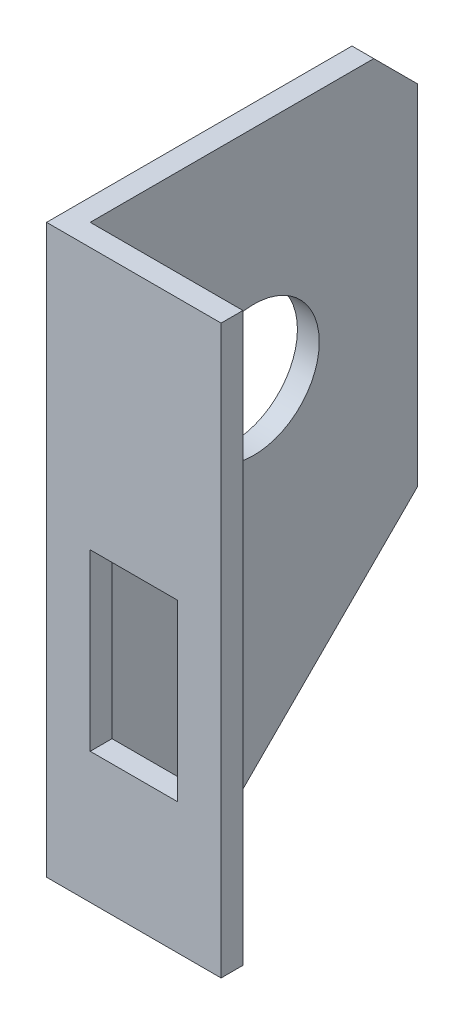
ISO-10303-21;
HEADER;
FILE_DESCRIPTION(('STEP AP214'),'2;1');
FILE_NAME('part.step','',(''),(''),'','','');
FILE_SCHEMA(('AUTOMOTIVE_DESIGN { 1 0 10303 214 1 1 1 1 }'));
ENDSEC;
DATA;
#1=APPLICATION_CONTEXT('core data for automotive mechanical design processes');
#2=APPLICATION_PROTOCOL_DEFINITION('international standard','automotive_design',2000,#1);
#3=PRODUCT_CONTEXT('',#1,'mechanical');
#4=PRODUCT('Part','Part','',(#3));
#5=PRODUCT_RELATED_PRODUCT_CATEGORY('part','',(#4));
#6=PRODUCT_DEFINITION_FORMATION('','',#4);
#7=PRODUCT_DEFINITION_CONTEXT('part definition',#1,'design');
#8=PRODUCT_DEFINITION('design','',#6,#7);
#9=PRODUCT_DEFINITION_SHAPE('','',#8);
#10=(LENGTH_UNIT() NAMED_UNIT(*) SI_UNIT(.MILLI.,.METRE.));
#11=(NAMED_UNIT(*) PLANE_ANGLE_UNIT() SI_UNIT($,.RADIAN.));
#12=(NAMED_UNIT(*) SI_UNIT($,.STERADIAN.) SOLID_ANGLE_UNIT());
#13=UNCERTAINTY_MEASURE_WITH_UNIT(LENGTH_MEASURE(1.E-05),#10,'distance_accuracy_value','');
#14=(GEOMETRIC_REPRESENTATION_CONTEXT(3) GLOBAL_UNCERTAINTY_ASSIGNED_CONTEXT((#13)) GLOBAL_UNIT_ASSIGNED_CONTEXT((#10,
#11,#12)) REPRESENTATION_CONTEXT('',''));
#15=CARTESIAN_POINT('',(0.,0.,0.));
#16=DIRECTION('',(0.,0.,1.));
#17=DIRECTION('',(1.,0.,0.));
#18=AXIS2_PLACEMENT_3D('',#15,#16,#17);
#19=CARTESIAN_POINT('',(0.,-31.75,-1.5875));
#20=DIRECTION('',(0.,0.,-1.));
#21=DIRECTION('',(-1.,0.,0.));
#22=AXIS2_PLACEMENT_3D('',#19,#20,#21);
#23=PLANE('',#22);
#24=DIRECTION('',(1.,0.,0.));
#25=VECTOR('',#24,1.);
#26=CARTESIAN_POINT('',(6.35,-12.7,-1.5875));
#27=LINE('',#26,#25);
#28=CARTESIAN_POINT('',(-6.35,-12.7,-1.5875));
#29=VERTEX_POINT('',#28);
#30=CARTESIAN_POINT('',(6.35,-12.7,-1.5875));
#31=VERTEX_POINT('',#30);
#32=EDGE_CURVE('E142',#29,#31,#27,.T.);
#33=ORIENTED_EDGE('',*,*,#32,.T.);
#34=DIRECTION('',(0.,1.,0.));
#35=VECTOR('',#34,1.);
#36=CARTESIAN_POINT('',(6.34999999999999,12.7,-1.5875));
#37=LINE('',#36,#35);
#38=CARTESIAN_POINT('',(6.34999999999999,12.7,-1.5875));
#39=VERTEX_POINT('',#38);
#40=EDGE_CURVE('E129',#31,#39,#37,.T.);
#41=ORIENTED_EDGE('',*,*,#40,.T.);
#42=DIRECTION('',(-1.,0.,0.));
#43=VECTOR('',#42,1.);
#44=CARTESIAN_POINT('',(6.35,12.7,-1.5875));
#45=LINE('',#44,#43);
#46=CARTESIAN_POINT('',(-6.35,12.7,-1.5875));
#47=VERTEX_POINT('',#46);
#48=EDGE_CURVE('E159',#39,#47,#45,.T.);
#49=ORIENTED_EDGE('',*,*,#48,.T.);
#50=DIRECTION('',(0.,-1.,0.));
#51=VECTOR('',#50,1.);
#52=CARTESIAN_POINT('',(-6.35,12.7,-1.5875));
#53=LINE('',#52,#51);
#54=EDGE_CURVE('E149',#47,#29,#53,.T.);
#55=ORIENTED_EDGE('',*,*,#54,.T.);
#56=EDGE_LOOP('',(#33,#41,#49,#55));
#57=FACE_BOUND('',#56,.T.);
#58=DIRECTION('',(0.,1.,0.));
#59=VECTOR('',#58,1.);
#60=CARTESIAN_POINT('',(-9.525,-31.75,-1.5875));
#61=LINE('',#60,#59);
#62=CARTESIAN_POINT('',(-9.525,-31.75,-1.5875));
#63=VERTEX_POINT('',#62);
#64=CARTESIAN_POINT('',(-9.525,50.8,-1.5875));
#65=VERTEX_POINT('',#64);
#66=EDGE_CURVE('E42',#63,#65,#61,.T.);
#67=ORIENTED_EDGE('',*,*,#66,.T.);
#68=DIRECTION('',(-1.,0.,0.));
#69=VECTOR('',#68,1.);
#70=CARTESIAN_POINT('',(0.,50.8,-1.5875));
#71=LINE('',#70,#69);
#72=CARTESIAN_POINT('',(12.7,50.8,-1.5875));
#73=VERTEX_POINT('',#72);
#74=EDGE_CURVE('E190',#73,#65,#71,.T.);
#75=ORIENTED_EDGE('',*,*,#74,.F.);
#76=DIRECTION('',(0.,1.,0.));
#77=VECTOR('',#76,1.);
#78=CARTESIAN_POINT('',(12.7,-31.75,-1.5875));
#79=LINE('',#78,#77);
#80=CARTESIAN_POINT('',(12.7,-31.75,-1.5875));
#81=VERTEX_POINT('',#80);
#82=EDGE_CURVE('E11',#81,#73,#79,.T.);
#83=ORIENTED_EDGE('',*,*,#82,.F.);
#84=DIRECTION('',(-1.,0.,0.));
#85=VECTOR('',#84,1.);
#86=CARTESIAN_POINT('',(0.,-31.75,-1.5875));
#87=LINE('',#86,#85);
#88=EDGE_CURVE('E203',#81,#63,#87,.T.);
#89=ORIENTED_EDGE('',*,*,#88,.T.);
#90=EDGE_LOOP('',(#67,#75,#83,#89));
#91=FACE_BOUND('',#90,.T.);
#92=ADVANCED_FACE('F39',(#57,#91),#23,.T.);
#93=CARTESIAN_POINT('',(12.7,-31.75,0.));
#94=DIRECTION('',(-1.,0.,0.));
#95=DIRECTION('',(0.,0.,1.));
#96=AXIS2_PLACEMENT_3D('',#93,#94,#95);
#97=PLANE('',#96);
#98=ORIENTED_EDGE('',*,*,#82,.T.);
#99=DIRECTION('',(0.,0.,1.));
#100=VECTOR('',#99,1.);
#101=CARTESIAN_POINT('',(12.7,50.8,0.));
#102=LINE('',#101,#100);
#103=CARTESIAN_POINT('',(12.7,50.8,1.5875));
#104=VERTEX_POINT('',#103);
#105=EDGE_CURVE('E200',#73,#104,#102,.T.);
#106=ORIENTED_EDGE('',*,*,#105,.T.);
#107=DIRECTION('',(0.,1.,0.));
#108=VECTOR('',#107,1.);
#109=CARTESIAN_POINT('',(12.7,-31.75,1.5875));
#110=LINE('',#109,#108);
#111=CARTESIAN_POINT('',(12.7,-31.75,1.5875));
#112=VERTEX_POINT('',#111);
#113=EDGE_CURVE('E47',#112,#104,#110,.T.);
#114=ORIENTED_EDGE('',*,*,#113,.F.);
#115=DIRECTION('',(0.,0.,1.));
#116=VECTOR('',#115,1.);
#117=CARTESIAN_POINT('',(12.7,-31.75,0.));
#118=LINE('',#117,#116);
#119=EDGE_CURVE('E213',#81,#112,#118,.T.);
#120=ORIENTED_EDGE('',*,*,#119,.F.);
#121=EDGE_LOOP('',(#98,#106,#114,#120));
#122=FACE_BOUND('',#121,.T.);
#123=ADVANCED_FACE('F240',(#122),#97,.F.);
#124=CARTESIAN_POINT('',(0.,-31.75,1.5875));
#125=DIRECTION('',(0.,0.,-1.));
#126=DIRECTION('',(-1.,0.,0.));
#127=AXIS2_PLACEMENT_3D('',#124,#125,#126);
#128=PLANE('',#127);
#129=DIRECTION('',(0.,1.,0.));
#130=VECTOR('',#129,1.);
#131=CARTESIAN_POINT('',(6.34999999999999,12.7,1.5875));
#132=LINE('',#131,#130);
#133=CARTESIAN_POINT('',(6.35,-12.7,1.5875));
#134=VERTEX_POINT('',#133);
#135=CARTESIAN_POINT('',(6.34999999999999,12.7,1.5875));
#136=VERTEX_POINT('',#135);
#137=EDGE_CURVE('E151',#134,#136,#132,.T.);
#138=ORIENTED_EDGE('',*,*,#137,.F.);
#139=DIRECTION('',(1.,0.,0.));
#140=VECTOR('',#139,1.);
#141=CARTESIAN_POINT('',(6.35,-12.7,1.5875));
#142=LINE('',#141,#140);
#143=CARTESIAN_POINT('',(-6.35,-12.7,1.5875));
#144=VERTEX_POINT('',#143);
#145=EDGE_CURVE('E145',#144,#134,#142,.T.);
#146=ORIENTED_EDGE('',*,*,#145,.F.);
#147=DIRECTION('',(0.,-1.,0.));
#148=VECTOR('',#147,1.);
#149=CARTESIAN_POINT('',(-6.35,12.7,1.5875));
#150=LINE('',#149,#148);
#151=CARTESIAN_POINT('',(-6.35,12.7,1.5875));
#152=VERTEX_POINT('',#151);
#153=EDGE_CURVE('E155',#152,#144,#150,.T.);
#154=ORIENTED_EDGE('',*,*,#153,.F.);
#155=DIRECTION('',(-1.,0.,0.));
#156=VECTOR('',#155,1.);
#157=CARTESIAN_POINT('',(6.34999999999999,12.7,1.5875));
#158=LINE('',#157,#156);
#159=EDGE_CURVE('E63',#136,#152,#158,.T.);
#160=ORIENTED_EDGE('',*,*,#159,.F.);
#161=EDGE_LOOP('',(#138,#146,#154,#160));
#162=FACE_BOUND('',#161,.T.);
#163=ORIENTED_EDGE('',*,*,#113,.T.);
#164=DIRECTION('',(-1.,0.,0.));
#165=VECTOR('',#164,1.);
#166=CARTESIAN_POINT('',(0.,50.8,1.5875));
#167=LINE('',#166,#165);
#168=CARTESIAN_POINT('',(-12.7,50.8,1.5875));
#169=VERTEX_POINT('',#168);
#170=EDGE_CURVE('E197',#104,#169,#167,.T.);
#171=ORIENTED_EDGE('',*,*,#170,.T.);
#172=DIRECTION('',(0.,1.,0.));
#173=VECTOR('',#172,1.);
#174=CARTESIAN_POINT('',(-12.7,-31.75,1.5875));
#175=LINE('',#174,#173);
#176=CARTESIAN_POINT('',(-12.7,-31.75,1.5875));
#177=VERTEX_POINT('',#176);
#178=EDGE_CURVE('E216',#177,#169,#175,.T.);
#179=ORIENTED_EDGE('',*,*,#178,.F.);
#180=DIRECTION('',(-1.,0.,0.));
#181=VECTOR('',#180,1.);
#182=CARTESIAN_POINT('',(0.,-31.75,1.5875));
#183=LINE('',#182,#181);
#184=EDGE_CURVE('E210',#112,#177,#183,.T.);
#185=ORIENTED_EDGE('',*,*,#184,.F.);
#186=EDGE_LOOP('',(#163,#171,#179,#185));
#187=FACE_BOUND('',#186,.T.);
#188=ADVANCED_FACE('F260',(#162,#187),#128,.F.);
#189=CARTESIAN_POINT('',(-12.7,-31.75,0.));
#190=DIRECTION('',(-1.,0.,0.));
#191=DIRECTION('',(0.,0.,1.));
#192=AXIS2_PLACEMENT_3D('',#189,#190,#191);
#193=PLANE('',#192);
#194=DIRECTION('',(0.,-0.707106781186548,0.707106781186548));
#195=VECTOR('',#194,1.);
#196=CARTESIAN_POINT('',(-12.7,-31.75,-23.8125));
#197=LINE('',#196,#195);
#198=CARTESIAN_POINT('',(-12.7,-6.35,-49.2125));
#199=VERTEX_POINT('',#198);
#200=CARTESIAN_POINT('',(-12.7,-31.75,-23.8125));
#201=VERTEX_POINT('',#200);
#202=EDGE_CURVE('E179',#199,#201,#197,.T.);
#203=ORIENTED_EDGE('',*,*,#202,.T.);
#204=DIRECTION('',(0.,0.,1.));
#205=VECTOR('',#204,1.);
#206=CARTESIAN_POINT('',(-12.7,-31.75,0.));
#207=LINE('',#206,#205);
#208=EDGE_CURVE('E208',#201,#177,#207,.T.);
#209=ORIENTED_EDGE('',*,*,#208,.T.);
#210=ORIENTED_EDGE('',*,*,#178,.T.);
#211=DIRECTION('',(0.,0.,1.));
#212=VECTOR('',#211,1.);
#213=CARTESIAN_POINT('',(-12.7,50.8,0.));
#214=LINE('',#213,#212);
#215=CARTESIAN_POINT('',(-12.7,50.8,-42.8625));
#216=VERTEX_POINT('',#215);
#217=EDGE_CURVE('E195',#216,#169,#214,.T.);
#218=ORIENTED_EDGE('',*,*,#217,.F.);
#219=DIRECTION('',(0.,-0.707106781186548,-0.707106781186547));
#220=VECTOR('',#219,1.);
#221=CARTESIAN_POINT('',(-12.7,50.8,-42.8625));
#222=LINE('',#221,#220);
#223=CARTESIAN_POINT('',(-12.7,44.45,-49.2125));
#224=VERTEX_POINT('',#223);
#225=EDGE_CURVE('E171',#216,#224,#222,.T.);
#226=ORIENTED_EDGE('',*,*,#225,.T.);
#227=DIRECTION('',(0.,1.,0.));
#228=VECTOR('',#227,1.);
#229=CARTESIAN_POINT('',(-12.7,-31.75,-49.2125));
#230=LINE('',#229,#228);
#231=EDGE_CURVE('E219',#199,#224,#230,.T.);
#232=ORIENTED_EDGE('',*,*,#231,.F.);
#233=EDGE_LOOP('',(#203,#209,#210,#218,#226,#232));
#234=FACE_BOUND('',#233,.T.);
#235=CARTESIAN_POINT('',(-12.7,19.05,-25.4));
#236=DIRECTION('',(-1.,0.,0.));
#237=DIRECTION('',(0.,0.,1.));
#238=AXIS2_PLACEMENT_3D('',#235,#236,#237);
#239=CIRCLE('',#238,9.52500000000003);
#240=CARTESIAN_POINT('',(-12.7,19.05,-15.875));
#241=VERTEX_POINT('',#240);
#242=EDGE_CURVE('E187',#241,#241,#239,.F.);
#243=ORIENTED_EDGE('',*,*,#242,.T.);
#244=EDGE_LOOP('',(#243));
#245=FACE_BOUND('',#244,.T.);
#246=ADVANCED_FACE('F256',(#234,#245),#193,.T.);
#247=CARTESIAN_POINT('',(-1.07552855510562E-13,-31.75,-49.2125));
#248=DIRECTION('',(0.,0.,-1.));
#249=DIRECTION('',(-1.,0.,0.));
#250=AXIS2_PLACEMENT_3D('',#247,#248,#249);
#251=PLANE('',#250);
#252=DIRECTION('',(1.,0.,0.));
#253=VECTOR('',#252,1.);
#254=CARTESIAN_POINT('',(-48.6210244842766,-6.35,-49.2125));
#255=LINE('',#254,#253);
#256=CARTESIAN_POINT('',(-9.525,-6.35,-49.2125));
#257=VERTEX_POINT('',#256);
#258=EDGE_CURVE('E180',#199,#257,#255,.T.);
#259=ORIENTED_EDGE('',*,*,#258,.F.);
#260=ORIENTED_EDGE('',*,*,#231,.T.);
#261=DIRECTION('',(1.,0.,0.));
#262=VECTOR('',#261,1.);
#263=CARTESIAN_POINT('',(-48.6210244842766,44.45,-49.2125));
#264=LINE('',#263,#262);
#265=CARTESIAN_POINT('',(-9.525,44.45,-49.2125));
#266=VERTEX_POINT('',#265);
#267=EDGE_CURVE('E167',#224,#266,#264,.T.);
#268=ORIENTED_EDGE('',*,*,#267,.T.);
#269=DIRECTION('',(0.,1.,0.));
#270=VECTOR('',#269,1.);
#271=CARTESIAN_POINT('',(-9.52500000000001,-31.75,-49.2125));
#272=LINE('',#271,#270);
#273=EDGE_CURVE('E221',#257,#266,#272,.T.);
#274=ORIENTED_EDGE('',*,*,#273,.F.);
#275=EDGE_LOOP('',(#259,#260,#268,#274));
#276=FACE_BOUND('',#275,.T.);
#277=ADVANCED_FACE('F250',(#276),#251,.T.);
#278=CARTESIAN_POINT('',(-9.525,-31.75,0.));
#279=DIRECTION('',(-1.,0.,0.));
#280=DIRECTION('',(0.,0.,1.));
#281=AXIS2_PLACEMENT_3D('',#278,#279,#280);
#282=PLANE('',#281);
#283=CARTESIAN_POINT('',(-9.525,19.05,-25.4));
#284=DIRECTION('',(1.,0.,0.));
#285=DIRECTION('',(0.,0.,-1.));
#286=AXIS2_PLACEMENT_3D('',#283,#284,#285);
#287=CIRCLE('',#286,9.52500000000003);
#288=CARTESIAN_POINT('',(-9.525,19.05,-34.925));
#289=VERTEX_POINT('',#288);
#290=EDGE_CURVE('E176',#289,#289,#287,.T.);
#291=ORIENTED_EDGE('',*,*,#290,.F.);
#292=EDGE_LOOP('',(#291));
#293=FACE_BOUND('',#292,.T.);
#294=DIRECTION('',(0.,0.,1.));
#295=VECTOR('',#294,1.);
#296=CARTESIAN_POINT('',(-9.525,-31.75,0.));
#297=LINE('',#296,#295);
#298=CARTESIAN_POINT('',(-9.525,-31.75,-23.8125));
#299=VERTEX_POINT('',#298);
#300=EDGE_CURVE('E206',#299,#63,#297,.T.);
#301=ORIENTED_EDGE('',*,*,#300,.F.);
#302=DIRECTION('',(0.,-0.707106781186547,0.707106781186547));
#303=VECTOR('',#302,1.);
#304=CARTESIAN_POINT('',(-9.525,-31.75,-23.8125));
#305=LINE('',#304,#303);
#306=EDGE_CURVE('E168',#257,#299,#305,.T.);
#307=ORIENTED_EDGE('',*,*,#306,.F.);
#308=ORIENTED_EDGE('',*,*,#273,.T.);
#309=DIRECTION('',(0.,-0.707106781186548,-0.707106781186547));
#310=VECTOR('',#309,1.);
#311=CARTESIAN_POINT('',(-9.525,50.8,-42.8625));
#312=LINE('',#311,#310);
#313=CARTESIAN_POINT('',(-9.525,50.8,-42.8625));
#314=VERTEX_POINT('',#313);
#315=EDGE_CURVE('E174',#314,#266,#312,.T.);
#316=ORIENTED_EDGE('',*,*,#315,.F.);
#317=DIRECTION('',(0.,0.,1.));
#318=VECTOR('',#317,1.);
#319=CARTESIAN_POINT('',(-9.525,50.8,0.));
#320=LINE('',#319,#318);
#321=EDGE_CURVE('E193',#314,#65,#320,.T.);
#322=ORIENTED_EDGE('',*,*,#321,.T.);
#323=ORIENTED_EDGE('',*,*,#66,.F.);
#324=EDGE_LOOP('',(#301,#307,#308,#316,#322,#323));
#325=FACE_BOUND('',#324,.T.);
#326=ADVANCED_FACE('F246',(#293,#325),#282,.F.);
#327=CARTESIAN_POINT('',(0.,-31.75,0.));
#328=DIRECTION('',(0.,1.,0.));
#329=DIRECTION('',(0.,0.,1.));
#330=AXIS2_PLACEMENT_3D('',#327,#328,#329);
#331=PLANE('',#330);
#332=ORIENTED_EDGE('',*,*,#208,.F.);
#333=DIRECTION('',(1.,0.,0.));
#334=VECTOR('',#333,1.);
#335=CARTESIAN_POINT('',(-48.6210244842766,-31.75,-23.8125));
#336=LINE('',#335,#334);
#337=EDGE_CURVE('E164',#201,#299,#336,.T.);
#338=ORIENTED_EDGE('',*,*,#337,.T.);
#339=ORIENTED_EDGE('',*,*,#300,.T.);
#340=ORIENTED_EDGE('',*,*,#88,.F.);
#341=ORIENTED_EDGE('',*,*,#119,.T.);
#342=ORIENTED_EDGE('',*,*,#184,.T.);
#343=EDGE_LOOP('',(#332,#338,#339,#340,#341,#342));
#344=FACE_BOUND('',#343,.T.);
#345=ADVANCED_FACE('F245',(#344),#331,.F.);
#346=CARTESIAN_POINT('',(0.,50.8,0.));
#347=DIRECTION('',(0.,1.,0.));
#348=DIRECTION('',(0.,0.,1.));
#349=AXIS2_PLACEMENT_3D('',#346,#347,#348);
#350=PLANE('',#349);
#351=DIRECTION('',(1.,0.,0.));
#352=VECTOR('',#351,1.);
#353=CARTESIAN_POINT('',(-48.6210244842766,50.8,-42.8625));
#354=LINE('',#353,#352);
#355=EDGE_CURVE('E165',#216,#314,#354,.T.);
#356=ORIENTED_EDGE('',*,*,#355,.F.);
#357=ORIENTED_EDGE('',*,*,#217,.T.);
#358=ORIENTED_EDGE('',*,*,#170,.F.);
#359=ORIENTED_EDGE('',*,*,#105,.F.);
#360=ORIENTED_EDGE('',*,*,#74,.T.);
#361=ORIENTED_EDGE('',*,*,#321,.F.);
#362=EDGE_LOOP('',(#356,#357,#358,#359,#360,#361));
#363=FACE_BOUND('',#362,.T.);
#364=ADVANCED_FACE('F236',(#363),#350,.T.);
#365=CARTESIAN_POINT('',(-48.6210244842766,50.8,-42.8625));
#366=DIRECTION('',(0.,-0.707106781186547,0.707106781186548));
#367=DIRECTION('',(0.,-0.707106781186548,-0.707106781186547));
#368=AXIS2_PLACEMENT_3D('',#365,#366,#367);
#369=PLANE('',#368);
#370=ORIENTED_EDGE('',*,*,#355,.T.);
#371=ORIENTED_EDGE('',*,*,#315,.T.);
#372=ORIENTED_EDGE('',*,*,#267,.F.);
#373=ORIENTED_EDGE('',*,*,#225,.F.);
#374=EDGE_LOOP('',(#370,#371,#372,#373));
#375=FACE_BOUND('',#374,.T.);
#376=ADVANCED_FACE('F253',(#375),#369,.F.);
#377=CARTESIAN_POINT('',(-48.6210244842766,-31.75,-23.8125));
#378=DIRECTION('',(0.,0.707106781186547,0.707106781186547));
#379=DIRECTION('',(0.,-0.707106781186548,0.707106781186548));
#380=AXIS2_PLACEMENT_3D('',#377,#378,#379);
#381=PLANE('',#380);
#382=ORIENTED_EDGE('',*,*,#258,.T.);
#383=ORIENTED_EDGE('',*,*,#306,.T.);
#384=ORIENTED_EDGE('',*,*,#337,.F.);
#385=ORIENTED_EDGE('',*,*,#202,.F.);
#386=EDGE_LOOP('',(#382,#383,#384,#385));
#387=FACE_BOUND('',#386,.T.);
#388=ADVANCED_FACE('F334',(#387),#381,.F.);
#389=CARTESIAN_POINT('',(-48.6210244842766,19.05,-25.4));
#390=DIRECTION('',(1.,0.,0.));
#391=DIRECTION('',(0.,0.,-1.));
#392=AXIS2_PLACEMENT_3D('',#389,#390,#391);
#393=CYLINDRICAL_SURFACE('',#392,9.52500000000003);
#394=ORIENTED_EDGE('',*,*,#290,.T.);
#395=EDGE_LOOP('',(#394));
#396=FACE_BOUND('',#395,.T.);
#397=ORIENTED_EDGE('',*,*,#242,.F.);
#398=EDGE_LOOP('',(#397));
#399=FACE_BOUND('',#398,.T.);
#400=ADVANCED_FACE('F343',(#396,#399),#393,.F.);
#401=CARTESIAN_POINT('',(6.35,-12.7,-29.9855633142473));
#402=DIRECTION('',(0.,-1.,0.));
#403=DIRECTION('',(1.,0.,0.));
#404=AXIS2_PLACEMENT_3D('',#401,#402,#403);
#405=PLANE('',#404);
#406=DIRECTION('',(0.,0.,1.));
#407=VECTOR('',#406,1.);
#408=CARTESIAN_POINT('',(-6.35,-12.7,-29.9855633142473));
#409=LINE('',#408,#407);
#410=EDGE_CURVE('E55',#29,#144,#409,.T.);
#411=ORIENTED_EDGE('',*,*,#410,.T.);
#412=ORIENTED_EDGE('',*,*,#145,.T.);
#413=DIRECTION('',(0.,0.,1.));
#414=VECTOR('',#413,1.);
#415=CARTESIAN_POINT('',(6.35,-12.7,-29.9855633142473));
#416=LINE('',#415,#414);
#417=EDGE_CURVE('E133',#31,#134,#416,.T.);
#418=ORIENTED_EDGE('',*,*,#417,.F.);
#419=ORIENTED_EDGE('',*,*,#32,.F.);
#420=EDGE_LOOP('',(#411,#412,#418,#419));
#421=FACE_BOUND('',#420,.T.);
#422=ADVANCED_FACE('F141',(#421),#405,.F.);
#423=CARTESIAN_POINT('',(6.34999999999999,12.7,-29.9855633142473));
#424=DIRECTION('',(1.,0.,0.));
#425=DIRECTION('',(0.,1.,0.));
#426=AXIS2_PLACEMENT_3D('',#423,#424,#425);
#427=PLANE('',#426);
#428=ORIENTED_EDGE('',*,*,#417,.T.);
#429=ORIENTED_EDGE('',*,*,#137,.T.);
#430=DIRECTION('',(0.,0.,1.));
#431=VECTOR('',#430,1.);
#432=CARTESIAN_POINT('',(6.34999999999999,12.7,-29.9855633142473));
#433=LINE('',#432,#431);
#434=EDGE_CURVE('E135',#39,#136,#433,.T.);
#435=ORIENTED_EDGE('',*,*,#434,.F.);
#436=ORIENTED_EDGE('',*,*,#40,.F.);
#437=EDGE_LOOP('',(#428,#429,#435,#436));
#438=FACE_BOUND('',#437,.T.);
#439=ADVANCED_FACE('F131',(#438),#427,.F.);
#440=CARTESIAN_POINT('',(6.34999999999999,12.7,-29.9855633142473));
#441=DIRECTION('',(0.,1.,0.));
#442=DIRECTION('',(0.,0.,1.));
#443=AXIS2_PLACEMENT_3D('',#440,#441,#442);
#444=PLANE('',#443);
#445=ORIENTED_EDGE('',*,*,#434,.T.);
#446=ORIENTED_EDGE('',*,*,#159,.T.);
#447=DIRECTION('',(0.,0.,1.));
#448=VECTOR('',#447,1.);
#449=CARTESIAN_POINT('',(-6.35,12.7,-29.9855633142473));
#450=LINE('',#449,#448);
#451=EDGE_CURVE('E158',#47,#152,#450,.T.);
#452=ORIENTED_EDGE('',*,*,#451,.F.);
#453=ORIENTED_EDGE('',*,*,#48,.F.);
#454=EDGE_LOOP('',(#445,#446,#452,#453));
#455=FACE_BOUND('',#454,.T.);
#456=ADVANCED_FACE('F368',(#455),#444,.F.);
#457=CARTESIAN_POINT('',(-6.35,12.7,-29.9855633142473));
#458=DIRECTION('',(-1.,0.,0.));
#459=DIRECTION('',(0.,-1.,0.));
#460=AXIS2_PLACEMENT_3D('',#457,#458,#459);
#461=PLANE('',#460);
#462=ORIENTED_EDGE('',*,*,#451,.T.);
#463=ORIENTED_EDGE('',*,*,#153,.T.);
#464=ORIENTED_EDGE('',*,*,#410,.F.);
#465=ORIENTED_EDGE('',*,*,#54,.F.);
#466=EDGE_LOOP('',(#462,#463,#464,#465));
#467=FACE_BOUND('',#466,.T.);
#468=ADVANCED_FACE('F375',(#467),#461,.F.);
#469=CLOSED_SHELL('',(#92,#123,#188,#246,#277,#326,#345,#364,#376,#388,#400,#422,#439,#456,#468));
#470=MANIFOLD_SOLID_BREP('B2',#469);
#471=ADVANCED_BREP_SHAPE_REPRESENTATION('',(#18,#470),#14);
#472=SHAPE_DEFINITION_REPRESENTATION(#9,#471);
ENDSEC;
END-ISO-10303-21;
